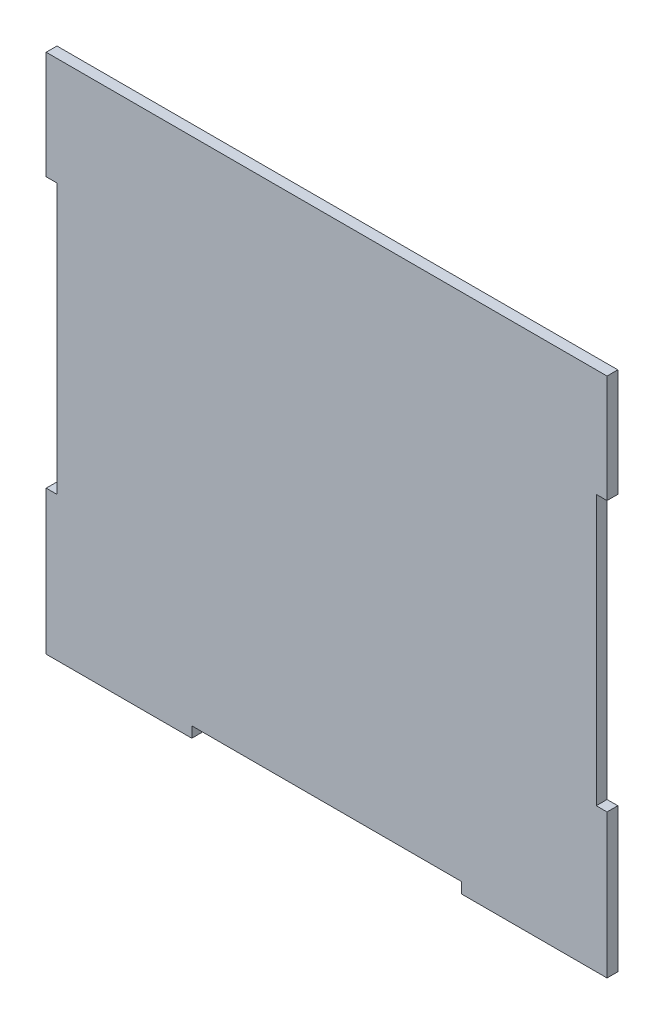
ISO-10303-21;
HEADER;
FILE_DESCRIPTION(('STEP AP214'),'2;1');
FILE_NAME('part.step','',(''),(''),'','','');
FILE_SCHEMA(('AUTOMOTIVE_DESIGN { 1 0 10303 214 1 1 1 1 }'));
ENDSEC;
DATA;
#1=APPLICATION_CONTEXT('core data for automotive mechanical design processes');
#2=APPLICATION_PROTOCOL_DEFINITION('international standard','automotive_design',2000,#1);
#3=PRODUCT_CONTEXT('',#1,'mechanical');
#4=PRODUCT('Part','Part','',(#3));
#5=PRODUCT_RELATED_PRODUCT_CATEGORY('part','',(#4));
#6=PRODUCT_DEFINITION_FORMATION('','',#4);
#7=PRODUCT_DEFINITION_CONTEXT('part definition',#1,'design');
#8=PRODUCT_DEFINITION('design','',#6,#7);
#9=PRODUCT_DEFINITION_SHAPE('','',#8);
#10=(LENGTH_UNIT() NAMED_UNIT(*) SI_UNIT(.MILLI.,.METRE.));
#11=(NAMED_UNIT(*) PLANE_ANGLE_UNIT() SI_UNIT($,.RADIAN.));
#12=(NAMED_UNIT(*) SI_UNIT($,.STERADIAN.) SOLID_ANGLE_UNIT());
#13=UNCERTAINTY_MEASURE_WITH_UNIT(LENGTH_MEASURE(1.E-05),#10,'distance_accuracy_value','');
#14=(GEOMETRIC_REPRESENTATION_CONTEXT(3) GLOBAL_UNCERTAINTY_ASSIGNED_CONTEXT((#13)) GLOBAL_UNIT_ASSIGNED_CONTEXT((#10,
#11,#12)) REPRESENTATION_CONTEXT('',''));
#15=CARTESIAN_POINT('',(0.,0.,0.));
#16=DIRECTION('',(0.,0.,1.));
#17=DIRECTION('',(1.,0.,0.));
#18=AXIS2_PLACEMENT_3D('',#15,#16,#17);
#19=CARTESIAN_POINT('',(0.,0.,3.));
#20=DIRECTION('',(1.,0.,0.));
#21=DIRECTION('',(0.,1.,0.));
#22=AXIS2_PLACEMENT_3D('',#19,#20,#21);
#23=PLANE('',#22);
#24=DIRECTION('',(0.,-1.,0.));
#25=VECTOR('',#24,1.);
#26=CARTESIAN_POINT('',(0.,0.,0.));
#27=LINE('',#26,#25);
#28=CARTESIAN_POINT('',(0.,40.,0.));
#29=VERTEX_POINT('',#28);
#30=CARTESIAN_POINT('',(0.,0.,0.));
#31=VERTEX_POINT('',#30);
#32=EDGE_CURVE('E188',#29,#31,#27,.T.);
#33=ORIENTED_EDGE('',*,*,#32,.T.);
#34=DIRECTION('',(0.,0.,-1.));
#35=VECTOR('',#34,1.);
#36=CARTESIAN_POINT('',(0.,0.,3.));
#37=LINE('',#36,#35);
#38=CARTESIAN_POINT('',(0.,0.,3.));
#39=VERTEX_POINT('',#38);
#40=EDGE_CURVE('E11',#39,#31,#37,.T.);
#41=ORIENTED_EDGE('',*,*,#40,.F.);
#42=DIRECTION('',(0.,-1.,0.));
#43=VECTOR('',#42,1.);
#44=CARTESIAN_POINT('',(0.,0.,3.));
#45=LINE('',#44,#43);
#46=CARTESIAN_POINT('',(0.,40.,3.));
#47=VERTEX_POINT('',#46);
#48=EDGE_CURVE('E234',#47,#39,#45,.T.);
#49=ORIENTED_EDGE('',*,*,#48,.F.);
#50=DIRECTION('',(0.,0.,-1.));
#51=VECTOR('',#50,1.);
#52=CARTESIAN_POINT('',(0.,40.,3.));
#53=LINE('',#52,#51);
#54=EDGE_CURVE('E184',#47,#29,#53,.T.);
#55=ORIENTED_EDGE('',*,*,#54,.T.);
#56=EDGE_LOOP('',(#33,#41,#49,#55));
#57=FACE_BOUND('',#56,.T.);
#58=ADVANCED_FACE('F39',(#57),#23,.F.);
#59=CARTESIAN_POINT('',(0.,0.,3.));
#60=DIRECTION('',(0.,1.,0.));
#61=DIRECTION('',(0.,0.,1.));
#62=AXIS2_PLACEMENT_3D('',#59,#60,#61);
#63=PLANE('',#62);
#64=DIRECTION('',(1.,0.,0.));
#65=VECTOR('',#64,1.);
#66=CARTESIAN_POINT('',(0.,0.,0.));
#67=LINE('',#66,#65);
#68=CARTESIAN_POINT('',(40.5,0.,0.));
#69=VERTEX_POINT('',#68);
#70=EDGE_CURVE('E192',#31,#69,#67,.T.);
#71=ORIENTED_EDGE('',*,*,#70,.T.);
#72=DIRECTION('',(0.,0.,-1.));
#73=VECTOR('',#72,1.);
#74=CARTESIAN_POINT('',(40.5,0.,3.));
#75=LINE('',#74,#73);
#76=CARTESIAN_POINT('',(40.5,0.,3.));
#77=VERTEX_POINT('',#76);
#78=EDGE_CURVE('E48',#77,#69,#75,.T.);
#79=ORIENTED_EDGE('',*,*,#78,.F.);
#80=DIRECTION('',(1.,0.,0.));
#81=VECTOR('',#80,1.);
#82=CARTESIAN_POINT('',(0.,0.,3.));
#83=LINE('',#82,#81);
#84=EDGE_CURVE('E123',#39,#77,#83,.T.);
#85=ORIENTED_EDGE('',*,*,#84,.F.);
#86=ORIENTED_EDGE('',*,*,#40,.T.);
#87=EDGE_LOOP('',(#71,#79,#85,#86));
#88=FACE_BOUND('',#87,.T.);
#89=ADVANCED_FACE('F356',(#88),#63,.F.);
#90=CARTESIAN_POINT('',(40.5,0.,3.));
#91=DIRECTION('',(-1.,0.,0.));
#92=DIRECTION('',(0.,0.,1.));
#93=AXIS2_PLACEMENT_3D('',#90,#91,#92);
#94=PLANE('',#93);
#95=DIRECTION('',(0.,1.,0.));
#96=VECTOR('',#95,1.);
#97=CARTESIAN_POINT('',(40.5,0.,0.));
#98=LINE('',#97,#96);
#99=CARTESIAN_POINT('',(40.5,3.,0.));
#100=VERTEX_POINT('',#99);
#101=EDGE_CURVE('E195',#69,#100,#98,.T.);
#102=ORIENTED_EDGE('',*,*,#101,.T.);
#103=DIRECTION('',(0.,0.,-1.));
#104=VECTOR('',#103,1.);
#105=CARTESIAN_POINT('',(40.5,3.,3.));
#106=LINE('',#105,#104);
#107=CARTESIAN_POINT('',(40.5,3.,3.));
#108=VERTEX_POINT('',#107);
#109=EDGE_CURVE('E277',#108,#100,#106,.T.);
#110=ORIENTED_EDGE('',*,*,#109,.F.);
#111=DIRECTION('',(0.,1.,0.));
#112=VECTOR('',#111,1.);
#113=CARTESIAN_POINT('',(40.5,0.,3.));
#114=LINE('',#113,#112);
#115=EDGE_CURVE('E287',#77,#108,#114,.T.);
#116=ORIENTED_EDGE('',*,*,#115,.F.);
#117=ORIENTED_EDGE('',*,*,#78,.T.);
#118=EDGE_LOOP('',(#102,#110,#116,#117));
#119=FACE_BOUND('',#118,.T.);
#120=ADVANCED_FACE('F285',(#119),#94,.F.);
#121=CARTESIAN_POINT('',(40.5,3.,3.));
#122=DIRECTION('',(0.,1.,0.));
#123=DIRECTION('',(0.,0.,1.));
#124=AXIS2_PLACEMENT_3D('',#121,#122,#123);
#125=PLANE('',#124);
#126=DIRECTION('',(1.,0.,0.));
#127=VECTOR('',#126,1.);
#128=CARTESIAN_POINT('',(40.5,3.,0.));
#129=LINE('',#128,#127);
#130=CARTESIAN_POINT('',(115.5,3.,0.));
#131=VERTEX_POINT('',#130);
#132=EDGE_CURVE('E198',#100,#131,#129,.T.);
#133=ORIENTED_EDGE('',*,*,#132,.T.);
#134=DIRECTION('',(0.,0.,-1.));
#135=VECTOR('',#134,1.);
#136=CARTESIAN_POINT('',(115.5,3.,3.));
#137=LINE('',#136,#135);
#138=CARTESIAN_POINT('',(115.5,3.,3.));
#139=VERTEX_POINT('',#138);
#140=EDGE_CURVE('E273',#139,#131,#137,.T.);
#141=ORIENTED_EDGE('',*,*,#140,.F.);
#142=DIRECTION('',(1.,0.,0.));
#143=VECTOR('',#142,1.);
#144=CARTESIAN_POINT('',(40.5,3.,3.));
#145=LINE('',#144,#143);
#146=EDGE_CURVE('E306',#108,#139,#145,.T.);
#147=ORIENTED_EDGE('',*,*,#146,.F.);
#148=ORIENTED_EDGE('',*,*,#109,.T.);
#149=EDGE_LOOP('',(#133,#141,#147,#148));
#150=FACE_BOUND('',#149,.T.);
#151=ADVANCED_FACE('F296',(#150),#125,.F.);
#152=CARTESIAN_POINT('',(115.5,0.,3.));
#153=DIRECTION('',(1.,0.,0.));
#154=DIRECTION('',(0.,0.,-1.));
#155=AXIS2_PLACEMENT_3D('',#152,#153,#154);
#156=PLANE('',#155);
#157=DIRECTION('',(0.,-1.,0.));
#158=VECTOR('',#157,1.);
#159=CARTESIAN_POINT('',(115.5,0.,0.));
#160=LINE('',#159,#158);
#161=CARTESIAN_POINT('',(115.5,0.,0.));
#162=VERTEX_POINT('',#161);
#163=EDGE_CURVE('E201',#131,#162,#160,.T.);
#164=ORIENTED_EDGE('',*,*,#163,.T.);
#165=DIRECTION('',(0.,0.,-1.));
#166=VECTOR('',#165,1.);
#167=CARTESIAN_POINT('',(115.5,0.,3.));
#168=LINE('',#167,#166);
#169=CARTESIAN_POINT('',(115.5,0.,3.));
#170=VERTEX_POINT('',#169);
#171=EDGE_CURVE('E269',#170,#162,#168,.T.);
#172=ORIENTED_EDGE('',*,*,#171,.F.);
#173=DIRECTION('',(0.,-1.,0.));
#174=VECTOR('',#173,1.);
#175=CARTESIAN_POINT('',(115.5,0.,3.));
#176=LINE('',#175,#174);
#177=EDGE_CURVE('E302',#139,#170,#176,.T.);
#178=ORIENTED_EDGE('',*,*,#177,.F.);
#179=ORIENTED_EDGE('',*,*,#140,.T.);
#180=EDGE_LOOP('',(#164,#172,#178,#179));
#181=FACE_BOUND('',#180,.T.);
#182=ADVANCED_FACE('F300',(#181),#156,.F.);
#183=CARTESIAN_POINT('',(115.5,0.,3.));
#184=DIRECTION('',(0.,1.,0.));
#185=DIRECTION('',(0.,0.,1.));
#186=AXIS2_PLACEMENT_3D('',#183,#184,#185);
#187=PLANE('',#186);
#188=DIRECTION('',(1.,0.,0.));
#189=VECTOR('',#188,1.);
#190=CARTESIAN_POINT('',(115.5,0.,0.));
#191=LINE('',#190,#189);
#192=CARTESIAN_POINT('',(156.,0.,0.));
#193=VERTEX_POINT('',#192);
#194=EDGE_CURVE('E204',#162,#193,#191,.T.);
#195=ORIENTED_EDGE('',*,*,#194,.T.);
#196=DIRECTION('',(0.,0.,-1.));
#197=VECTOR('',#196,1.);
#198=CARTESIAN_POINT('',(156.,0.,3.));
#199=LINE('',#198,#197);
#200=CARTESIAN_POINT('',(156.,0.,3.));
#201=VERTEX_POINT('',#200);
#202=EDGE_CURVE('E265',#201,#193,#199,.T.);
#203=ORIENTED_EDGE('',*,*,#202,.F.);
#204=DIRECTION('',(1.,0.,0.));
#205=VECTOR('',#204,1.);
#206=CARTESIAN_POINT('',(115.5,0.,3.));
#207=LINE('',#206,#205);
#208=EDGE_CURVE('E305',#170,#201,#207,.T.);
#209=ORIENTED_EDGE('',*,*,#208,.F.);
#210=ORIENTED_EDGE('',*,*,#171,.T.);
#211=EDGE_LOOP('',(#195,#203,#209,#210));
#212=FACE_BOUND('',#211,.T.);
#213=ADVANCED_FACE('F369',(#212),#187,.F.);
#214=CARTESIAN_POINT('',(156.,0.,3.));
#215=DIRECTION('',(-1.,0.,0.));
#216=DIRECTION('',(0.,0.,1.));
#217=AXIS2_PLACEMENT_3D('',#214,#215,#216);
#218=PLANE('',#217);
#219=DIRECTION('',(0.,1.,0.));
#220=VECTOR('',#219,1.);
#221=CARTESIAN_POINT('',(156.,0.,0.));
#222=LINE('',#221,#220);
#223=CARTESIAN_POINT('',(156.,40.,0.));
#224=VERTEX_POINT('',#223);
#225=EDGE_CURVE('E207',#193,#224,#222,.T.);
#226=ORIENTED_EDGE('',*,*,#225,.T.);
#227=DIRECTION('',(0.,0.,-1.));
#228=VECTOR('',#227,1.);
#229=CARTESIAN_POINT('',(156.,40.,3.));
#230=LINE('',#229,#228);
#231=CARTESIAN_POINT('',(156.,40.,3.));
#232=VERTEX_POINT('',#231);
#233=EDGE_CURVE('E261',#232,#224,#230,.T.);
#234=ORIENTED_EDGE('',*,*,#233,.F.);
#235=DIRECTION('',(0.,1.,0.));
#236=VECTOR('',#235,1.);
#237=CARTESIAN_POINT('',(156.,0.,3.));
#238=LINE('',#237,#236);
#239=EDGE_CURVE('E310',#201,#232,#238,.T.);
#240=ORIENTED_EDGE('',*,*,#239,.F.);
#241=ORIENTED_EDGE('',*,*,#202,.T.);
#242=EDGE_LOOP('',(#226,#234,#240,#241));
#243=FACE_BOUND('',#242,.T.);
#244=ADVANCED_FACE('F372',(#243),#218,.F.);
#245=CARTESIAN_POINT('',(156.,40.,3.));
#246=DIRECTION('',(0.,-1.,0.));
#247=DIRECTION('',(0.,0.,-1.));
#248=AXIS2_PLACEMENT_3D('',#245,#246,#247);
#249=PLANE('',#248);
#250=DIRECTION('',(-1.,0.,0.));
#251=VECTOR('',#250,1.);
#252=CARTESIAN_POINT('',(156.,40.,0.));
#253=LINE('',#252,#251);
#254=CARTESIAN_POINT('',(153.,40.,0.));
#255=VERTEX_POINT('',#254);
#256=EDGE_CURVE('E210',#224,#255,#253,.T.);
#257=ORIENTED_EDGE('',*,*,#256,.T.);
#258=DIRECTION('',(0.,0.,-1.));
#259=VECTOR('',#258,1.);
#260=CARTESIAN_POINT('',(153.,40.,3.));
#261=LINE('',#260,#259);
#262=CARTESIAN_POINT('',(153.,40.,3.));
#263=VERTEX_POINT('',#262);
#264=EDGE_CURVE('E257',#263,#255,#261,.T.);
#265=ORIENTED_EDGE('',*,*,#264,.F.);
#266=DIRECTION('',(-1.,0.,0.));
#267=VECTOR('',#266,1.);
#268=CARTESIAN_POINT('',(156.,40.,3.));
#269=LINE('',#268,#267);
#270=EDGE_CURVE('E317',#232,#263,#269,.T.);
#271=ORIENTED_EDGE('',*,*,#270,.F.);
#272=ORIENTED_EDGE('',*,*,#233,.T.);
#273=EDGE_LOOP('',(#257,#265,#271,#272));
#274=FACE_BOUND('',#273,.T.);
#275=ADVANCED_FACE('F376',(#274),#249,.F.);
#276=CARTESIAN_POINT('',(153.,115.,3.));
#277=DIRECTION('',(-1.,0.,0.));
#278=DIRECTION('',(0.,0.,1.));
#279=AXIS2_PLACEMENT_3D('',#276,#277,#278);
#280=PLANE('',#279);
#281=DIRECTION('',(0.,1.,0.));
#282=VECTOR('',#281,1.);
#283=CARTESIAN_POINT('',(153.,115.,0.));
#284=LINE('',#283,#282);
#285=CARTESIAN_POINT('',(153.,115.,0.));
#286=VERTEX_POINT('',#285);
#287=EDGE_CURVE('E213',#255,#286,#284,.T.);
#288=ORIENTED_EDGE('',*,*,#287,.T.);
#289=DIRECTION('',(0.,0.,-1.));
#290=VECTOR('',#289,1.);
#291=CARTESIAN_POINT('',(153.,115.,3.));
#292=LINE('',#291,#290);
#293=CARTESIAN_POINT('',(153.,115.,3.));
#294=VERTEX_POINT('',#293);
#295=EDGE_CURVE('E253',#294,#286,#292,.T.);
#296=ORIENTED_EDGE('',*,*,#295,.F.);
#297=DIRECTION('',(0.,1.,0.));
#298=VECTOR('',#297,1.);
#299=CARTESIAN_POINT('',(153.,115.,3.));
#300=LINE('',#299,#298);
#301=EDGE_CURVE('E320',#263,#294,#300,.T.);
#302=ORIENTED_EDGE('',*,*,#301,.F.);
#303=ORIENTED_EDGE('',*,*,#264,.T.);
#304=EDGE_LOOP('',(#288,#296,#302,#303));
#305=FACE_BOUND('',#304,.T.);
#306=ADVANCED_FACE('F380',(#305),#280,.F.);
#307=CARTESIAN_POINT('',(156.,115.,3.));
#308=DIRECTION('',(0.,1.,0.));
#309=DIRECTION('',(0.,0.,1.));
#310=AXIS2_PLACEMENT_3D('',#307,#308,#309);
#311=PLANE('',#310);
#312=DIRECTION('',(1.,0.,0.));
#313=VECTOR('',#312,1.);
#314=CARTESIAN_POINT('',(156.,115.,0.));
#315=LINE('',#314,#313);
#316=CARTESIAN_POINT('',(156.,115.,0.));
#317=VERTEX_POINT('',#316);
#318=EDGE_CURVE('E216',#286,#317,#315,.T.);
#319=ORIENTED_EDGE('',*,*,#318,.T.);
#320=DIRECTION('',(0.,0.,-1.));
#321=VECTOR('',#320,1.);
#322=CARTESIAN_POINT('',(156.,115.,3.));
#323=LINE('',#322,#321);
#324=CARTESIAN_POINT('',(156.,115.,3.));
#325=VERTEX_POINT('',#324);
#326=EDGE_CURVE('E249',#325,#317,#323,.T.);
#327=ORIENTED_EDGE('',*,*,#326,.F.);
#328=DIRECTION('',(1.,0.,0.));
#329=VECTOR('',#328,1.);
#330=CARTESIAN_POINT('',(156.,115.,3.));
#331=LINE('',#330,#329);
#332=EDGE_CURVE('E323',#294,#325,#331,.T.);
#333=ORIENTED_EDGE('',*,*,#332,.F.);
#334=ORIENTED_EDGE('',*,*,#295,.T.);
#335=EDGE_LOOP('',(#319,#327,#333,#334));
#336=FACE_BOUND('',#335,.T.);
#337=ADVANCED_FACE('F384',(#336),#311,.F.);
#338=CARTESIAN_POINT('',(156.,115.,3.));
#339=DIRECTION('',(-1.,0.,0.));
#340=DIRECTION('',(0.,0.,1.));
#341=AXIS2_PLACEMENT_3D('',#338,#339,#340);
#342=PLANE('',#341);
#343=DIRECTION('',(0.,1.,0.));
#344=VECTOR('',#343,1.);
#345=CARTESIAN_POINT('',(156.,115.,0.));
#346=LINE('',#345,#344);
#347=CARTESIAN_POINT('',(156.,145.,0.));
#348=VERTEX_POINT('',#347);
#349=EDGE_CURVE('E219',#317,#348,#346,.T.);
#350=ORIENTED_EDGE('',*,*,#349,.T.);
#351=DIRECTION('',(0.,0.,-1.));
#352=VECTOR('',#351,1.);
#353=CARTESIAN_POINT('',(156.,145.,3.));
#354=LINE('',#353,#352);
#355=CARTESIAN_POINT('',(156.,145.,3.));
#356=VERTEX_POINT('',#355);
#357=EDGE_CURVE('E245',#356,#348,#354,.T.);
#358=ORIENTED_EDGE('',*,*,#357,.F.);
#359=DIRECTION('',(0.,1.,0.));
#360=VECTOR('',#359,1.);
#361=CARTESIAN_POINT('',(156.,115.,3.));
#362=LINE('',#361,#360);
#363=EDGE_CURVE('E326',#325,#356,#362,.T.);
#364=ORIENTED_EDGE('',*,*,#363,.F.);
#365=ORIENTED_EDGE('',*,*,#326,.T.);
#366=EDGE_LOOP('',(#350,#358,#364,#365));
#367=FACE_BOUND('',#366,.T.);
#368=ADVANCED_FACE('F388',(#367),#342,.F.);
#369=CARTESIAN_POINT('',(0.,145.,3.));
#370=DIRECTION('',(0.,-1.,0.));
#371=DIRECTION('',(0.,0.,-1.));
#372=AXIS2_PLACEMENT_3D('',#369,#370,#371);
#373=PLANE('',#372);
#374=DIRECTION('',(-1.,0.,0.));
#375=VECTOR('',#374,1.);
#376=CARTESIAN_POINT('',(0.,145.,0.));
#377=LINE('',#376,#375);
#378=CARTESIAN_POINT('',(0.,145.,0.));
#379=VERTEX_POINT('',#378);
#380=EDGE_CURVE('E222',#348,#379,#377,.T.);
#381=ORIENTED_EDGE('',*,*,#380,.T.);
#382=DIRECTION('',(0.,0.,-1.));
#383=VECTOR('',#382,1.);
#384=CARTESIAN_POINT('',(0.,145.,3.));
#385=LINE('',#384,#383);
#386=CARTESIAN_POINT('',(0.,145.,3.));
#387=VERTEX_POINT('',#386);
#388=EDGE_CURVE('E241',#387,#379,#385,.T.);
#389=ORIENTED_EDGE('',*,*,#388,.F.);
#390=DIRECTION('',(-1.,0.,0.));
#391=VECTOR('',#390,1.);
#392=CARTESIAN_POINT('',(0.,145.,3.));
#393=LINE('',#392,#391);
#394=EDGE_CURVE('E329',#356,#387,#393,.T.);
#395=ORIENTED_EDGE('',*,*,#394,.F.);
#396=ORIENTED_EDGE('',*,*,#357,.T.);
#397=EDGE_LOOP('',(#381,#389,#395,#396));
#398=FACE_BOUND('',#397,.T.);
#399=ADVANCED_FACE('F337',(#398),#373,.F.);
#400=CARTESIAN_POINT('',(0.,115.,3.));
#401=DIRECTION('',(1.,0.,0.));
#402=DIRECTION('',(0.,1.,0.));
#403=AXIS2_PLACEMENT_3D('',#400,#401,#402);
#404=PLANE('',#403);
#405=DIRECTION('',(0.,-1.,0.));
#406=VECTOR('',#405,1.);
#407=CARTESIAN_POINT('',(0.,115.,0.));
#408=LINE('',#407,#406);
#409=CARTESIAN_POINT('',(0.,115.,0.));
#410=VERTEX_POINT('',#409);
#411=EDGE_CURVE('E225',#379,#410,#408,.T.);
#412=ORIENTED_EDGE('',*,*,#411,.T.);
#413=DIRECTION('',(0.,0.,-1.));
#414=VECTOR('',#413,1.);
#415=CARTESIAN_POINT('',(0.,115.,3.));
#416=LINE('',#415,#414);
#417=CARTESIAN_POINT('',(0.,115.,3.));
#418=VERTEX_POINT('',#417);
#419=EDGE_CURVE('E177',#418,#410,#416,.T.);
#420=ORIENTED_EDGE('',*,*,#419,.F.);
#421=DIRECTION('',(0.,-1.,0.));
#422=VECTOR('',#421,1.);
#423=CARTESIAN_POINT('',(0.,115.,3.));
#424=LINE('',#423,#422);
#425=EDGE_CURVE('E166',#387,#418,#424,.T.);
#426=ORIENTED_EDGE('',*,*,#425,.F.);
#427=ORIENTED_EDGE('',*,*,#388,.T.);
#428=EDGE_LOOP('',(#412,#420,#426,#427));
#429=FACE_BOUND('',#428,.T.);
#430=ADVANCED_FACE('F341',(#429),#404,.F.);
#431=CARTESIAN_POINT('',(0.,115.,3.));
#432=DIRECTION('',(0.,1.,0.));
#433=DIRECTION('',(0.,0.,1.));
#434=AXIS2_PLACEMENT_3D('',#431,#432,#433);
#435=PLANE('',#434);
#436=DIRECTION('',(1.,0.,0.));
#437=VECTOR('',#436,1.);
#438=CARTESIAN_POINT('',(0.,115.,0.));
#439=LINE('',#438,#437);
#440=CARTESIAN_POINT('',(3.,115.,0.));
#441=VERTEX_POINT('',#440);
#442=EDGE_CURVE('E175',#410,#441,#439,.T.);
#443=ORIENTED_EDGE('',*,*,#442,.T.);
#444=DIRECTION('',(0.,0.,-1.));
#445=VECTOR('',#444,1.);
#446=CARTESIAN_POINT('',(3.,115.,3.));
#447=LINE('',#446,#445);
#448=CARTESIAN_POINT('',(3.,115.,3.));
#449=VERTEX_POINT('',#448);
#450=EDGE_CURVE('E172',#449,#441,#447,.T.);
#451=ORIENTED_EDGE('',*,*,#450,.F.);
#452=DIRECTION('',(1.,0.,0.));
#453=VECTOR('',#452,1.);
#454=CARTESIAN_POINT('',(0.,115.,3.));
#455=LINE('',#454,#453);
#456=EDGE_CURVE('E160',#418,#449,#455,.T.);
#457=ORIENTED_EDGE('',*,*,#456,.F.);
#458=ORIENTED_EDGE('',*,*,#419,.T.);
#459=EDGE_LOOP('',(#443,#451,#457,#458));
#460=FACE_BOUND('',#459,.T.);
#461=ADVANCED_FACE('F173',(#460),#435,.F.);
#462=CARTESIAN_POINT('',(3.,115.,3.));
#463=DIRECTION('',(1.,0.,0.));
#464=DIRECTION('',(0.,1.,0.));
#465=AXIS2_PLACEMENT_3D('',#462,#463,#464);
#466=PLANE('',#465);
#467=DIRECTION('',(0.,-1.,0.));
#468=VECTOR('',#467,1.);
#469=CARTESIAN_POINT('',(3.,115.,0.));
#470=LINE('',#469,#468);
#471=CARTESIAN_POINT('',(3.00000000000001,40.,0.));
#472=VERTEX_POINT('',#471);
#473=EDGE_CURVE('E109',#441,#472,#470,.T.);
#474=ORIENTED_EDGE('',*,*,#473,.T.);
#475=DIRECTION('',(0.,0.,-1.));
#476=VECTOR('',#475,1.);
#477=CARTESIAN_POINT('',(3.00000000000001,40.,3.));
#478=LINE('',#477,#476);
#479=CARTESIAN_POINT('',(3.00000000000001,40.,3.));
#480=VERTEX_POINT('',#479);
#481=EDGE_CURVE('E178',#480,#472,#478,.T.);
#482=ORIENTED_EDGE('',*,*,#481,.F.);
#483=DIRECTION('',(0.,-1.,0.));
#484=VECTOR('',#483,1.);
#485=CARTESIAN_POINT('',(3.,115.,3.));
#486=LINE('',#485,#484);
#487=EDGE_CURVE('E164',#449,#480,#486,.T.);
#488=ORIENTED_EDGE('',*,*,#487,.F.);
#489=ORIENTED_EDGE('',*,*,#450,.T.);
#490=EDGE_LOOP('',(#474,#482,#488,#489));
#491=FACE_BOUND('',#490,.T.);
#492=ADVANCED_FACE('F180',(#491),#466,.F.);
#493=CARTESIAN_POINT('',(0.,40.,3.));
#494=DIRECTION('',(0.,-1.,0.));
#495=DIRECTION('',(1.,0.,0.));
#496=AXIS2_PLACEMENT_3D('',#493,#494,#495);
#497=PLANE('',#496);
#498=DIRECTION('',(-1.,0.,0.));
#499=VECTOR('',#498,1.);
#500=CARTESIAN_POINT('',(0.,40.,0.));
#501=LINE('',#500,#499);
#502=EDGE_CURVE('E115',#472,#29,#501,.T.);
#503=ORIENTED_EDGE('',*,*,#502,.T.);
#504=ORIENTED_EDGE('',*,*,#54,.F.);
#505=DIRECTION('',(-1.,0.,0.));
#506=VECTOR('',#505,1.);
#507=CARTESIAN_POINT('',(0.,40.,3.));
#508=LINE('',#507,#506);
#509=EDGE_CURVE('E56',#480,#47,#508,.T.);
#510=ORIENTED_EDGE('',*,*,#509,.F.);
#511=ORIENTED_EDGE('',*,*,#481,.T.);
#512=EDGE_LOOP('',(#503,#504,#510,#511));
#513=FACE_BOUND('',#512,.T.);
#514=ADVANCED_FACE('F345',(#513),#497,.F.);
#515=CARTESIAN_POINT('',(0.,0.,3.));
#516=DIRECTION('',(0.,0.,-1.));
#517=DIRECTION('',(-1.,0.,0.));
#518=AXIS2_PLACEMENT_3D('',#515,#516,#517);
#519=PLANE('',#518);
#520=ORIENTED_EDGE('',*,*,#48,.T.);
#521=ORIENTED_EDGE('',*,*,#84,.T.);
#522=ORIENTED_EDGE('',*,*,#115,.T.);
#523=ORIENTED_EDGE('',*,*,#146,.T.);
#524=ORIENTED_EDGE('',*,*,#177,.T.);
#525=ORIENTED_EDGE('',*,*,#208,.T.);
#526=ORIENTED_EDGE('',*,*,#239,.T.);
#527=ORIENTED_EDGE('',*,*,#270,.T.);
#528=ORIENTED_EDGE('',*,*,#301,.T.);
#529=ORIENTED_EDGE('',*,*,#332,.T.);
#530=ORIENTED_EDGE('',*,*,#363,.T.);
#531=ORIENTED_EDGE('',*,*,#394,.T.);
#532=ORIENTED_EDGE('',*,*,#425,.T.);
#533=ORIENTED_EDGE('',*,*,#456,.T.);
#534=ORIENTED_EDGE('',*,*,#487,.T.);
#535=ORIENTED_EDGE('',*,*,#509,.T.);
#536=EDGE_LOOP('',(#520,#521,#522,#523,#524,#525,#526,#527,#528,#529,#530,#531,#532,#533,#534,#535));
#537=FACE_BOUND('',#536,.T.);
#538=ADVANCED_FACE('F162',(#537),#519,.F.);
#539=CARTESIAN_POINT('',(0.,0.,0.));
#540=DIRECTION('',(0.,0.,-1.));
#541=DIRECTION('',(-1.,0.,0.));
#542=AXIS2_PLACEMENT_3D('',#539,#540,#541);
#543=PLANE('',#542);
#544=ORIENTED_EDGE('',*,*,#32,.F.);
#545=ORIENTED_EDGE('',*,*,#502,.F.);
#546=ORIENTED_EDGE('',*,*,#473,.F.);
#547=ORIENTED_EDGE('',*,*,#442,.F.);
#548=ORIENTED_EDGE('',*,*,#411,.F.);
#549=ORIENTED_EDGE('',*,*,#380,.F.);
#550=ORIENTED_EDGE('',*,*,#349,.F.);
#551=ORIENTED_EDGE('',*,*,#318,.F.);
#552=ORIENTED_EDGE('',*,*,#287,.F.);
#553=ORIENTED_EDGE('',*,*,#256,.F.);
#554=ORIENTED_EDGE('',*,*,#225,.F.);
#555=ORIENTED_EDGE('',*,*,#194,.F.);
#556=ORIENTED_EDGE('',*,*,#163,.F.);
#557=ORIENTED_EDGE('',*,*,#132,.F.);
#558=ORIENTED_EDGE('',*,*,#101,.F.);
#559=ORIENTED_EDGE('',*,*,#70,.F.);
#560=EDGE_LOOP('',(#544,#545,#546,#547,#548,#549,#550,#551,#552,#553,#554,#555,#556,#557,#558,#559));
#561=FACE_BOUND('',#560,.T.);
#562=ADVANCED_FACE('F291',(#561),#543,.T.);
#563=CLOSED_SHELL('',(#58,#89,#120,#151,#182,#213,#244,#275,#306,#337,#368,#399,#430,#461,#492,
#514,#538,#562));
#564=MANIFOLD_SOLID_BREP('B2',#563);
#565=ADVANCED_BREP_SHAPE_REPRESENTATION('',(#18,#564),#14);
#566=SHAPE_DEFINITION_REPRESENTATION(#9,#565);
ENDSEC;
END-ISO-10303-21;
